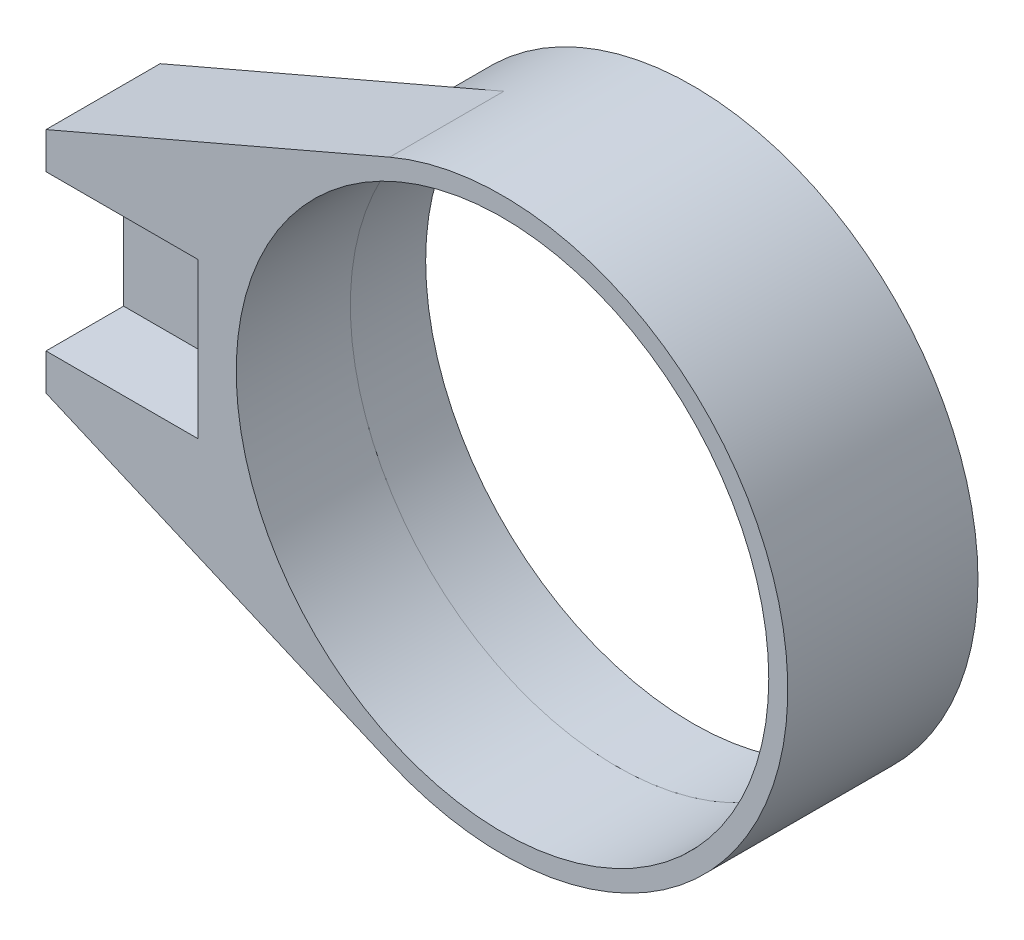
ISO-10303-21;
HEADER;
FILE_DESCRIPTION(('STEP AP214'),'2;1');
FILE_NAME('part.step','',(''),(''),'','','');
FILE_SCHEMA(('AUTOMOTIVE_DESIGN { 1 0 10303 214 1 1 1 1 }'));
ENDSEC;
DATA;
#1=APPLICATION_CONTEXT('core data for automotive mechanical design processes');
#2=APPLICATION_PROTOCOL_DEFINITION('international standard','automotive_design',2000,#1);
#3=PRODUCT_CONTEXT('',#1,'mechanical');
#4=PRODUCT('Part','Part','',(#3));
#5=PRODUCT_RELATED_PRODUCT_CATEGORY('part','',(#4));
#6=PRODUCT_DEFINITION_FORMATION('','',#4);
#7=PRODUCT_DEFINITION_CONTEXT('part definition',#1,'design');
#8=PRODUCT_DEFINITION('design','',#6,#7);
#9=PRODUCT_DEFINITION_SHAPE('','',#8);
#10=(LENGTH_UNIT() NAMED_UNIT(*) SI_UNIT(.MILLI.,.METRE.));
#11=(NAMED_UNIT(*) PLANE_ANGLE_UNIT() SI_UNIT($,.RADIAN.));
#12=(NAMED_UNIT(*) SI_UNIT($,.STERADIAN.) SOLID_ANGLE_UNIT());
#13=UNCERTAINTY_MEASURE_WITH_UNIT(LENGTH_MEASURE(1.E-05),#10,'distance_accuracy_value','');
#14=(GEOMETRIC_REPRESENTATION_CONTEXT(3) GLOBAL_UNCERTAINTY_ASSIGNED_CONTEXT((#13)) GLOBAL_UNIT_ASSIGNED_CONTEXT((#10,
#11,#12)) REPRESENTATION_CONTEXT('',''));
#15=CARTESIAN_POINT('',(0.,0.,0.));
#16=DIRECTION('',(0.,0.,1.));
#17=DIRECTION('',(1.,0.,0.));
#18=AXIS2_PLACEMENT_3D('',#15,#16,#17);
#19=CARTESIAN_POINT('',(0.,0.,0.));
#20=DIRECTION('',(0.,0.,1.));
#21=DIRECTION('',(1.,0.,0.));
#22=AXIS2_PLACEMENT_3D('',#19,#20,#21);
#23=PLANE('',#22);
#24=CARTESIAN_POINT('',(0.,0.,0.));
#25=DIRECTION('',(0.,0.,1.));
#26=DIRECTION('',(1.,0.,0.));
#27=AXIS2_PLACEMENT_3D('',#24,#25,#26);
#28=CIRCLE('',#27,37.5);
#29=CARTESIAN_POINT('',(37.5,0.,0.));
#30=VERTEX_POINT('',#29);
#31=EDGE_CURVE('E37',#30,#30,#28,.T.);
#32=ORIENTED_EDGE('',*,*,#31,.F.);
#33=EDGE_LOOP('',(#32));
#34=FACE_BOUND('',#33,.T.);
#35=CARTESIAN_POINT('',(0.,0.,0.));
#36=DIRECTION('',(0.,0.,1.));
#37=DIRECTION('',(1.,0.,0.));
#38=AXIS2_PLACEMENT_3D('',#35,#36,#37);
#39=CIRCLE('',#38,35.1);
#40=CARTESIAN_POINT('',(35.1,0.,0.));
#41=VERTEX_POINT('',#40);
#42=EDGE_CURVE('E163',#41,#41,#39,.T.);
#43=ORIENTED_EDGE('',*,*,#42,.T.);
#44=EDGE_LOOP('',(#43));
#45=FACE_BOUND('',#44,.T.);
#46=ADVANCED_FACE('F33',(#34,#45),#23,.F.);
#47=CARTESIAN_POINT('',(0.,0.,10.));
#48=DIRECTION('',(0.,0.,-1.));
#49=DIRECTION('',(-1.,0.,0.));
#50=AXIS2_PLACEMENT_3D('',#47,#48,#49);
#51=CYLINDRICAL_SURFACE('',#50,37.5);
#52=CARTESIAN_POINT('',(0.,0.,10.));
#53=DIRECTION('',(0.,0.,1.));
#54=DIRECTION('',(1.,0.,0.));
#55=AXIS2_PLACEMENT_3D('',#52,#53,#54);
#56=CIRCLE('',#55,37.5);
#57=CARTESIAN_POINT('',(-14.8263545687845,34.4445817248618,10.));
#58=VERTEX_POINT('',#57);
#59=CARTESIAN_POINT('',(-14.8263545687845,-34.4445817248618,10.));
#60=VERTEX_POINT('',#59);
#61=EDGE_CURVE('E11',#58,#60,#56,.T.);
#62=ORIENTED_EDGE('',*,*,#61,.F.);
#63=DIRECTION('',(0.,0.,-1.));
#64=VECTOR('',#63,1.);
#65=CARTESIAN_POINT('',(-14.8263545687845,34.4445817248618,25.));
#66=LINE('',#65,#64);
#67=CARTESIAN_POINT('',(-14.8263545687845,34.4445817248618,25.));
#68=VERTEX_POINT('',#67);
#69=EDGE_CURVE('E157',#68,#58,#66,.T.);
#70=ORIENTED_EDGE('',*,*,#69,.F.);
#71=CARTESIAN_POINT('',(0.,0.,25.));
#72=DIRECTION('',(0.,0.,1.));
#73=DIRECTION('',(1.,0.,0.));
#74=AXIS2_PLACEMENT_3D('',#71,#72,#73);
#75=CIRCLE('',#74,37.5);
#76=CARTESIAN_POINT('',(-14.8263545687845,-34.4445817248618,25.));
#77=VERTEX_POINT('',#76);
#78=EDGE_CURVE('E134',#77,#68,#75,.T.);
#79=ORIENTED_EDGE('',*,*,#78,.F.);
#80=DIRECTION('',(0.,0.,-1.));
#81=VECTOR('',#80,1.);
#82=CARTESIAN_POINT('',(-14.8263545687845,-34.4445817248618,25.));
#83=LINE('',#82,#81);
#84=EDGE_CURVE('E144',#77,#60,#83,.T.);
#85=ORIENTED_EDGE('',*,*,#84,.T.);
#86=EDGE_LOOP('',(#62,#70,#79,#85));
#87=FACE_BOUND('',#86,.T.);
#88=ORIENTED_EDGE('',*,*,#31,.T.);
#89=EDGE_LOOP('',(#88));
#90=FACE_BOUND('',#89,.T.);
#91=ADVANCED_FACE('F35',(#87,#90),#51,.T.);
#92=CARTESIAN_POINT('',(0.,0.,10.));
#93=DIRECTION('',(0.,0.,-1.));
#94=DIRECTION('',(-1.,0.,0.));
#95=AXIS2_PLACEMENT_3D('',#92,#93,#94);
#96=CYLINDRICAL_SURFACE('',#95,35.1);
#97=CARTESIAN_POINT('',(0.,0.,10.));
#98=DIRECTION('',(0.,0.,1.));
#99=DIRECTION('',(1.,0.,0.));
#100=AXIS2_PLACEMENT_3D('',#97,#98,#99);
#101=CIRCLE('',#100,35.1);
#102=CARTESIAN_POINT('',(35.1,0.,10.));
#103=VERTEX_POINT('',#102);
#104=EDGE_CURVE('E160',#103,#103,#101,.T.);
#105=ORIENTED_EDGE('',*,*,#104,.T.);
#106=EDGE_LOOP('',(#105));
#107=FACE_BOUND('',#106,.T.);
#108=ORIENTED_EDGE('',*,*,#42,.F.);
#109=EDGE_LOOP('',(#108));
#110=FACE_BOUND('',#109,.T.);
#111=ADVANCED_FACE('F175',(#107,#110),#96,.F.);
#112=CARTESIAN_POINT('',(0.,0.,10.));
#113=DIRECTION('',(0.,0.,1.));
#114=DIRECTION('',(1.,0.,0.));
#115=AXIS2_PLACEMENT_3D('',#112,#113,#114);
#116=PLANE('',#115);
#117=DIRECTION('',(-0.918522179329647,-0.395369455167588,0.));
#118=VECTOR('',#117,1.);
#119=CARTESIAN_POINT('',(-60.0000000000001,15.,10.));
#120=LINE('',#119,#118);
#121=CARTESIAN_POINT('',(-60.0000000000001,15.,10.));
#122=VERTEX_POINT('',#121);
#123=EDGE_CURVE('E129',#58,#122,#120,.T.);
#124=ORIENTED_EDGE('',*,*,#123,.F.);
#125=ORIENTED_EDGE('',*,*,#61,.T.);
#126=DIRECTION('',(0.918522179329647,-0.395369455167588,0.));
#127=VECTOR('',#126,1.);
#128=CARTESIAN_POINT('',(-60.0000000000001,-15.,10.));
#129=LINE('',#128,#127);
#130=CARTESIAN_POINT('',(-60.0000000000001,-15.,10.));
#131=VERTEX_POINT('',#130);
#132=EDGE_CURVE('E138',#131,#60,#129,.T.);
#133=ORIENTED_EDGE('',*,*,#132,.F.);
#134=DIRECTION('',(0.,-1.,0.));
#135=VECTOR('',#134,1.);
#136=CARTESIAN_POINT('',(-60.0000000000001,-15.,10.));
#137=LINE('',#136,#135);
#138=EDGE_CURVE('E146',#122,#131,#137,.T.);
#139=ORIENTED_EDGE('',*,*,#138,.F.);
#140=EDGE_LOOP('',(#124,#125,#133,#139));
#141=FACE_BOUND('',#140,.T.);
#142=ADVANCED_FACE('F180',(#141),#116,.F.);
#143=CARTESIAN_POINT('',(0.,0.,25.));
#144=DIRECTION('',(0.,0.,1.));
#145=DIRECTION('',(1.,0.,0.));
#146=AXIS2_PLACEMENT_3D('',#143,#144,#145);
#147=PLANE('',#146);
#148=DIRECTION('',(-1.,0.,0.));
#149=VECTOR('',#148,1.);
#150=CARTESIAN_POINT('',(-40.,-10.2,25.));
#151=LINE('',#150,#149);
#152=CARTESIAN_POINT('',(-40.,-10.2,25.));
#153=VERTEX_POINT('',#152);
#154=CARTESIAN_POINT('',(-60.0000000000001,-10.2,25.));
#155=VERTEX_POINT('',#154);
#156=EDGE_CURVE('E133',#153,#155,#151,.T.);
#157=ORIENTED_EDGE('',*,*,#156,.T.);
#158=DIRECTION('',(0.,-1.,0.));
#159=VECTOR('',#158,1.);
#160=CARTESIAN_POINT('',(-60.0000000000001,-15.,25.));
#161=LINE('',#160,#159);
#162=CARTESIAN_POINT('',(-60.0000000000001,-15.,25.));
#163=VERTEX_POINT('',#162);
#164=EDGE_CURVE('E140',#155,#163,#161,.T.);
#165=ORIENTED_EDGE('',*,*,#164,.T.);
#166=DIRECTION('',(0.918522179329647,-0.395369455167588,0.));
#167=VECTOR('',#166,1.);
#168=CARTESIAN_POINT('',(-60.0000000000001,-15.,25.));
#169=LINE('',#168,#167);
#170=EDGE_CURVE('E142',#163,#77,#169,.T.);
#171=ORIENTED_EDGE('',*,*,#170,.T.);
#172=ORIENTED_EDGE('',*,*,#78,.T.);
#173=DIRECTION('',(-0.918522179329647,-0.395369455167588,0.));
#174=VECTOR('',#173,1.);
#175=CARTESIAN_POINT('',(-60.0000000000001,15.,25.));
#176=LINE('',#175,#174);
#177=CARTESIAN_POINT('',(-60.0000000000001,15.,25.));
#178=VERTEX_POINT('',#177);
#179=EDGE_CURVE('E137',#68,#178,#176,.T.);
#180=ORIENTED_EDGE('',*,*,#179,.T.);
#181=CARTESIAN_POINT('',(-60.0000000000001,10.2,25.));
#182=VERTEX_POINT('',#181);
#183=EDGE_CURVE('E119',#178,#182,#161,.T.);
#184=ORIENTED_EDGE('',*,*,#183,.T.);
#185=DIRECTION('',(-1.,0.,0.));
#186=VECTOR('',#185,1.);
#187=CARTESIAN_POINT('',(-40.,10.2,25.));
#188=LINE('',#187,#186);
#189=CARTESIAN_POINT('',(-40.,10.2,25.));
#190=VERTEX_POINT('',#189);
#191=EDGE_CURVE('E48',#190,#182,#188,.T.);
#192=ORIENTED_EDGE('',*,*,#191,.F.);
#193=DIRECTION('',(0.,1.,0.));
#194=VECTOR('',#193,1.);
#195=CARTESIAN_POINT('',(-40.,10.2,25.));
#196=LINE('',#195,#194);
#197=EDGE_CURVE('E104',#153,#190,#196,.T.);
#198=ORIENTED_EDGE('',*,*,#197,.F.);
#199=EDGE_LOOP('',(#157,#165,#171,#172,#180,#184,#192,#198));
#200=FACE_BOUND('',#199,.T.);
#201=CARTESIAN_POINT('',(0.,0.,25.));
#202=DIRECTION('',(0.,0.,1.));
#203=DIRECTION('',(1.,0.,0.));
#204=AXIS2_PLACEMENT_3D('',#201,#202,#203);
#205=CIRCLE('',#204,35.);
#206=CARTESIAN_POINT('',(35.,0.,25.));
#207=VERTEX_POINT('',#206);
#208=EDGE_CURVE('E126',#207,#207,#205,.T.);
#209=ORIENTED_EDGE('',*,*,#208,.F.);
#210=EDGE_LOOP('',(#209));
#211=FACE_BOUND('',#210,.T.);
#212=ADVANCED_FACE('F116',(#200,#211),#147,.T.);
#213=ORIENTED_EDGE('',*,*,#104,.F.);
#214=EDGE_LOOP('',(#213));
#215=FACE_BOUND('',#214,.T.);
#216=CARTESIAN_POINT('',(0.,0.,10.));
#217=DIRECTION('',(0.,0.,1.));
#218=DIRECTION('',(1.,0.,0.));
#219=AXIS2_PLACEMENT_3D('',#216,#217,#218);
#220=CIRCLE('',#219,35.);
#221=CARTESIAN_POINT('',(35.,0.,10.));
#222=VERTEX_POINT('',#221);
#223=EDGE_CURVE('E130',#222,#222,#220,.T.);
#224=ORIENTED_EDGE('',*,*,#223,.T.);
#225=EDGE_LOOP('',(#224));
#226=FACE_BOUND('',#225,.T.);
#227=ADVANCED_FACE('F186',(#215,#226),#116,.F.);
#228=CARTESIAN_POINT('',(-60.0000000000001,15.,25.));
#229=DIRECTION('',(0.395369455167588,-0.918522179329647,0.));
#230=DIRECTION('',(0.918522179329647,0.395369455167588,0.));
#231=AXIS2_PLACEMENT_3D('',#228,#229,#230);
#232=PLANE('',#231);
#233=ORIENTED_EDGE('',*,*,#123,.T.);
#234=DIRECTION('',(0.,0.,-1.));
#235=VECTOR('',#234,1.);
#236=CARTESIAN_POINT('',(-60.0000000000001,15.,25.));
#237=LINE('',#236,#235);
#238=EDGE_CURVE('E154',#178,#122,#237,.T.);
#239=ORIENTED_EDGE('',*,*,#238,.F.);
#240=ORIENTED_EDGE('',*,*,#179,.F.);
#241=ORIENTED_EDGE('',*,*,#69,.T.);
#242=EDGE_LOOP('',(#233,#239,#240,#241));
#243=FACE_BOUND('',#242,.T.);
#244=ADVANCED_FACE('F182',(#243),#232,.F.);
#245=CARTESIAN_POINT('',(-60.0000000000001,-15.,25.));
#246=DIRECTION('',(1.,0.,0.));
#247=DIRECTION('',(0.,0.,-1.));
#248=AXIS2_PLACEMENT_3D('',#245,#246,#247);
#249=PLANE('',#248);
#250=ORIENTED_EDGE('',*,*,#164,.F.);
#251=DIRECTION('',(0.,0.,1.));
#252=VECTOR('',#251,1.);
#253=CARTESIAN_POINT('',(-60.0000000000001,-10.2,25.));
#254=LINE('',#253,#252);
#255=CARTESIAN_POINT('',(-60.0000000000001,-10.2,14.8));
#256=VERTEX_POINT('',#255);
#257=EDGE_CURVE('E113',#256,#155,#254,.T.);
#258=ORIENTED_EDGE('',*,*,#257,.F.);
#259=DIRECTION('',(0.,-1.,0.));
#260=VECTOR('',#259,1.);
#261=CARTESIAN_POINT('',(-60.0000000000001,10.2,14.8));
#262=LINE('',#261,#260);
#263=CARTESIAN_POINT('',(-60.0000000000001,10.2,14.8));
#264=VERTEX_POINT('',#263);
#265=EDGE_CURVE('E313',#264,#256,#262,.T.);
#266=ORIENTED_EDGE('',*,*,#265,.F.);
#267=DIRECTION('',(0.,0.,-1.));
#268=VECTOR('',#267,1.);
#269=CARTESIAN_POINT('',(-60.0000000000001,10.2,25.));
#270=LINE('',#269,#268);
#271=EDGE_CURVE('E311',#182,#264,#270,.T.);
#272=ORIENTED_EDGE('',*,*,#271,.F.);
#273=ORIENTED_EDGE('',*,*,#183,.F.);
#274=ORIENTED_EDGE('',*,*,#238,.T.);
#275=ORIENTED_EDGE('',*,*,#138,.T.);
#276=DIRECTION('',(0.,0.,-1.));
#277=VECTOR('',#276,1.);
#278=CARTESIAN_POINT('',(-60.0000000000001,-15.,25.));
#279=LINE('',#278,#277);
#280=EDGE_CURVE('E151',#163,#131,#279,.T.);
#281=ORIENTED_EDGE('',*,*,#280,.F.);
#282=EDGE_LOOP('',(#250,#258,#266,#272,#273,#274,#275,#281));
#283=FACE_BOUND('',#282,.T.);
#284=ADVANCED_FACE('F185',(#283),#249,.F.);
#285=CARTESIAN_POINT('',(-60.0000000000001,-15.,25.));
#286=DIRECTION('',(0.395369455167588,0.918522179329647,0.));
#287=DIRECTION('',(-0.918522179329647,0.395369455167588,0.));
#288=AXIS2_PLACEMENT_3D('',#285,#286,#287);
#289=PLANE('',#288);
#290=ORIENTED_EDGE('',*,*,#132,.T.);
#291=ORIENTED_EDGE('',*,*,#84,.F.);
#292=ORIENTED_EDGE('',*,*,#170,.F.);
#293=ORIENTED_EDGE('',*,*,#280,.T.);
#294=EDGE_LOOP('',(#290,#291,#292,#293));
#295=FACE_BOUND('',#294,.T.);
#296=ADVANCED_FACE('F190',(#295),#289,.F.);
#297=CARTESIAN_POINT('',(0.,0.,25.));
#298=DIRECTION('',(0.,0.,-1.));
#299=DIRECTION('',(-1.,0.,0.));
#300=AXIS2_PLACEMENT_3D('',#297,#298,#299);
#301=CYLINDRICAL_SURFACE('',#300,35.);
#302=ORIENTED_EDGE('',*,*,#208,.T.);
#303=EDGE_LOOP('',(#302));
#304=FACE_BOUND('',#303,.T.);
#305=ORIENTED_EDGE('',*,*,#223,.F.);
#306=EDGE_LOOP('',(#305));
#307=FACE_BOUND('',#306,.T.);
#308=ADVANCED_FACE('F194',(#304,#307),#301,.F.);
#309=CARTESIAN_POINT('',(-40.,-10.2,25.));
#310=DIRECTION('',(0.,-1.,0.));
#311=DIRECTION('',(0.,0.,-1.));
#312=AXIS2_PLACEMENT_3D('',#309,#310,#311);
#313=PLANE('',#312);
#314=ORIENTED_EDGE('',*,*,#257,.T.);
#315=ORIENTED_EDGE('',*,*,#156,.F.);
#316=DIRECTION('',(0.,0.,1.));
#317=VECTOR('',#316,1.);
#318=CARTESIAN_POINT('',(-40.,-10.2,25.));
#319=LINE('',#318,#317);
#320=CARTESIAN_POINT('',(-40.,-10.2,14.8));
#321=VERTEX_POINT('',#320);
#322=EDGE_CURVE('E110',#321,#153,#319,.T.);
#323=ORIENTED_EDGE('',*,*,#322,.F.);
#324=DIRECTION('',(-1.,0.,0.));
#325=VECTOR('',#324,1.);
#326=CARTESIAN_POINT('',(-40.,-10.2,14.8));
#327=LINE('',#326,#325);
#328=EDGE_CURVE('E121',#321,#256,#327,.T.);
#329=ORIENTED_EDGE('',*,*,#328,.T.);
#330=EDGE_LOOP('',(#314,#315,#323,#329));
#331=FACE_BOUND('',#330,.T.);
#332=ADVANCED_FACE('F203',(#331),#313,.F.);
#333=CARTESIAN_POINT('',(-40.,10.2,14.8));
#334=DIRECTION('',(0.,0.,-1.));
#335=DIRECTION('',(0.,1.,0.));
#336=AXIS2_PLACEMENT_3D('',#333,#334,#335);
#337=PLANE('',#336);
#338=ORIENTED_EDGE('',*,*,#265,.T.);
#339=ORIENTED_EDGE('',*,*,#328,.F.);
#340=DIRECTION('',(0.,-1.,0.));
#341=VECTOR('',#340,1.);
#342=CARTESIAN_POINT('',(-40.,10.2,14.8));
#343=LINE('',#342,#341);
#344=CARTESIAN_POINT('',(-40.,10.2,14.8));
#345=VERTEX_POINT('',#344);
#346=EDGE_CURVE('E103',#345,#321,#343,.T.);
#347=ORIENTED_EDGE('',*,*,#346,.F.);
#348=DIRECTION('',(-1.,0.,0.));
#349=VECTOR('',#348,1.);
#350=CARTESIAN_POINT('',(-40.,10.2,14.8));
#351=LINE('',#350,#349);
#352=EDGE_CURVE('E99',#345,#264,#351,.T.);
#353=ORIENTED_EDGE('',*,*,#352,.T.);
#354=EDGE_LOOP('',(#338,#339,#347,#353));
#355=FACE_BOUND('',#354,.T.);
#356=ADVANCED_FACE('F207',(#355),#337,.F.);
#357=CARTESIAN_POINT('',(-40.,10.2,25.));
#358=DIRECTION('',(0.,1.,0.));
#359=DIRECTION('',(0.,0.,1.));
#360=AXIS2_PLACEMENT_3D('',#357,#358,#359);
#361=PLANE('',#360);
#362=ORIENTED_EDGE('',*,*,#271,.T.);
#363=ORIENTED_EDGE('',*,*,#352,.F.);
#364=DIRECTION('',(0.,0.,-1.));
#365=VECTOR('',#364,1.);
#366=CARTESIAN_POINT('',(-40.,10.2,25.));
#367=LINE('',#366,#365);
#368=EDGE_CURVE('E96',#190,#345,#367,.T.);
#369=ORIENTED_EDGE('',*,*,#368,.F.);
#370=ORIENTED_EDGE('',*,*,#191,.T.);
#371=EDGE_LOOP('',(#362,#363,#369,#370));
#372=FACE_BOUND('',#371,.T.);
#373=ADVANCED_FACE('F98',(#372),#361,.F.);
#374=CARTESIAN_POINT('',(-40.,0.,0.));
#375=DIRECTION('',(1.,0.,0.));
#376=DIRECTION('',(0.,0.,-1.));
#377=AXIS2_PLACEMENT_3D('',#374,#375,#376);
#378=PLANE('',#377);
#379=ORIENTED_EDGE('',*,*,#197,.T.);
#380=ORIENTED_EDGE('',*,*,#368,.T.);
#381=ORIENTED_EDGE('',*,*,#346,.T.);
#382=ORIENTED_EDGE('',*,*,#322,.T.);
#383=EDGE_LOOP('',(#379,#380,#381,#382));
#384=FACE_BOUND('',#383,.T.);
#385=ADVANCED_FACE('F108',(#384),#378,.F.);
#386=CLOSED_SHELL('',(#46,#91,#111,#142,#212,#227,#244,#284,#296,#308,#332,#356,#373,#385));
#387=MANIFOLD_SOLID_BREP('B2',#386);
#388=ADVANCED_BREP_SHAPE_REPRESENTATION('',(#18,#387),#14);
#389=SHAPE_DEFINITION_REPRESENTATION(#9,#388);
ENDSEC;
END-ISO-10303-21;
